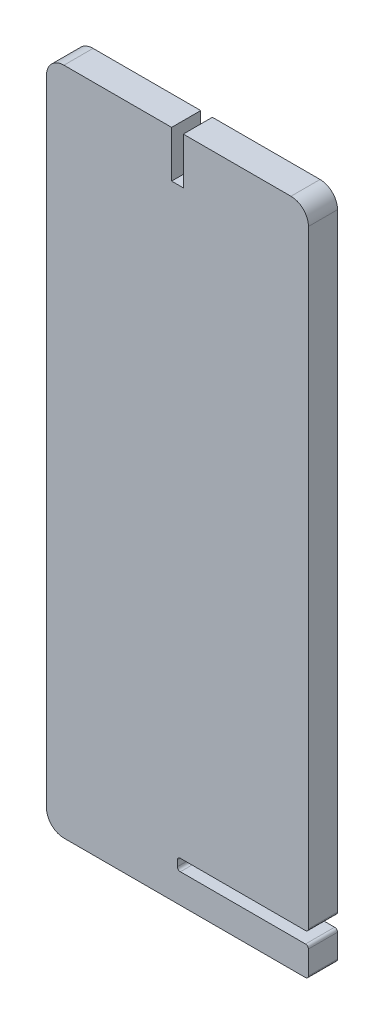
ISO-10303-21;
HEADER;
FILE_DESCRIPTION(('STEP AP214'),'2;1');
FILE_NAME('part.step','',(''),(''),'','','');
FILE_SCHEMA(('AUTOMOTIVE_DESIGN { 1 0 10303 214 1 1 1 1 }'));
ENDSEC;
DATA;
#1=APPLICATION_CONTEXT('core data for automotive mechanical design processes');
#2=APPLICATION_PROTOCOL_DEFINITION('international standard','automotive_design',2000,#1);
#3=PRODUCT_CONTEXT('',#1,'mechanical');
#4=PRODUCT('Part','Part','',(#3));
#5=PRODUCT_RELATED_PRODUCT_CATEGORY('part','',(#4));
#6=PRODUCT_DEFINITION_FORMATION('','',#4);
#7=PRODUCT_DEFINITION_CONTEXT('part definition',#1,'design');
#8=PRODUCT_DEFINITION('design','',#6,#7);
#9=PRODUCT_DEFINITION_SHAPE('','',#8);
#10=(LENGTH_UNIT() NAMED_UNIT(*) SI_UNIT(.MILLI.,.METRE.));
#11=(NAMED_UNIT(*) PLANE_ANGLE_UNIT() SI_UNIT($,.RADIAN.));
#12=(NAMED_UNIT(*) SI_UNIT($,.STERADIAN.) SOLID_ANGLE_UNIT());
#13=UNCERTAINTY_MEASURE_WITH_UNIT(LENGTH_MEASURE(1.E-05),#10,'distance_accuracy_value','');
#14=(GEOMETRIC_REPRESENTATION_CONTEXT(3) GLOBAL_UNCERTAINTY_ASSIGNED_CONTEXT((#13)) GLOBAL_UNIT_ASSIGNED_CONTEXT((#10,
#11,#12)) REPRESENTATION_CONTEXT('',''));
#15=CARTESIAN_POINT('',(0.,0.,0.));
#16=DIRECTION('',(0.,0.,1.));
#17=DIRECTION('',(1.,0.,0.));
#18=AXIS2_PLACEMENT_3D('',#15,#16,#17);
#19=CARTESIAN_POINT('',(-22.5,45.,5.));
#20=DIRECTION('',(0.,1.,0.));
#21=DIRECTION('',(0.,0.,1.));
#22=AXIS2_PLACEMENT_3D('',#19,#20,#21);
#23=PLANE('',#22);
#24=DIRECTION('',(0.,0.,1.));
#25=VECTOR('',#24,1.);
#26=CARTESIAN_POINT('',(1.,45.,-8.24621125123532));
#27=LINE('',#26,#25);
#28=CARTESIAN_POINT('',(1.,45.,0.));
#29=VERTEX_POINT('',#28);
#30=CARTESIAN_POINT('',(1.,45.,5.));
#31=VERTEX_POINT('',#30);
#32=EDGE_CURVE('E188',#29,#31,#27,.T.);
#33=ORIENTED_EDGE('',*,*,#32,.T.);
#34=DIRECTION('',(1.,0.,0.));
#35=VECTOR('',#34,1.);
#36=CARTESIAN_POINT('',(-22.5,45.,5.));
#37=LINE('',#36,#35);
#38=CARTESIAN_POINT('',(19.5,45.,5.));
#39=VERTEX_POINT('',#38);
#40=EDGE_CURVE('E257',#31,#39,#37,.T.);
#41=ORIENTED_EDGE('',*,*,#40,.T.);
#42=DIRECTION('',(0.,0.,-1.));
#43=VECTOR('',#42,1.);
#44=CARTESIAN_POINT('',(19.5,45.,5.));
#45=LINE('',#44,#43);
#46=CARTESIAN_POINT('',(19.5,45.,0.));
#47=VERTEX_POINT('',#46);
#48=EDGE_CURVE('E316',#39,#47,#45,.T.);
#49=ORIENTED_EDGE('',*,*,#48,.T.);
#50=DIRECTION('',(1.,0.,0.));
#51=VECTOR('',#50,1.);
#52=CARTESIAN_POINT('',(-22.5,45.,0.));
#53=LINE('',#52,#51);
#54=EDGE_CURVE('E248',#29,#47,#53,.T.);
#55=ORIENTED_EDGE('',*,*,#54,.F.);
#56=EDGE_LOOP('',(#33,#41,#49,#55));
#57=FACE_BOUND('',#56,.T.);
#58=ADVANCED_FACE('F43',(#57),#23,.T.);
#59=CARTESIAN_POINT('',(22.5,45.,5.));
#60=DIRECTION('',(1.,0.,0.));
#61=DIRECTION('',(0.,1.,0.));
#62=AXIS2_PLACEMENT_3D('',#59,#60,#61);
#63=PLANE('',#62);
#64=DIRECTION('',(0.,-1.,0.));
#65=VECTOR('',#64,1.);
#66=CARTESIAN_POINT('',(22.5,45.,5.));
#67=LINE('',#66,#65);
#68=CARTESIAN_POINT('',(22.5,42.,5.));
#69=VERTEX_POINT('',#68);
#70=CARTESIAN_POINT('',(22.5,-62.5,5.));
#71=VERTEX_POINT('',#70);
#72=EDGE_CURVE('E258',#69,#71,#67,.T.);
#73=ORIENTED_EDGE('',*,*,#72,.T.);
#74=DIRECTION('',(0.,0.,1.));
#75=VECTOR('',#74,1.);
#76=CARTESIAN_POINT('',(22.5,-62.5,0.));
#77=LINE('',#76,#75);
#78=CARTESIAN_POINT('',(22.5,-62.5,0.));
#79=VERTEX_POINT('',#78);
#80=EDGE_CURVE('E371',#71,#79,#77,.F.);
#81=ORIENTED_EDGE('',*,*,#80,.T.);
#82=DIRECTION('',(0.,-1.,0.));
#83=VECTOR('',#82,1.);
#84=CARTESIAN_POINT('',(22.5,45.,0.));
#85=LINE('',#84,#83);
#86=CARTESIAN_POINT('',(22.5,42.,0.));
#87=VERTEX_POINT('',#86);
#88=EDGE_CURVE('E273',#87,#79,#85,.T.);
#89=ORIENTED_EDGE('',*,*,#88,.F.);
#90=DIRECTION('',(0.,0.,-1.));
#91=VECTOR('',#90,1.);
#92=CARTESIAN_POINT('',(22.5,42.,5.));
#93=LINE('',#92,#91);
#94=EDGE_CURVE('E320',#87,#69,#93,.F.);
#95=ORIENTED_EDGE('',*,*,#94,.T.);
#96=EDGE_LOOP('',(#73,#81,#89,#95));
#97=FACE_BOUND('',#96,.T.);
#98=ADVANCED_FACE('F420',(#97),#63,.T.);
#99=DIRECTION('',(0.,0.,1.));
#100=VECTOR('',#99,1.);
#101=CARTESIAN_POINT('',(-1.,45.,-8.24621125123532));
#102=LINE('',#101,#100);
#103=CARTESIAN_POINT('',(-1.,45.,0.));
#104=VERTEX_POINT('',#103);
#105=CARTESIAN_POINT('',(-1.,45.,5.));
#106=VERTEX_POINT('',#105);
#107=EDGE_CURVE('E219',#104,#106,#102,.T.);
#108=ORIENTED_EDGE('',*,*,#107,.F.);
#109=CARTESIAN_POINT('',(-19.5,45.,0.));
#110=VERTEX_POINT('',#109);
#111=EDGE_CURVE('E269',#110,#104,#53,.T.);
#112=ORIENTED_EDGE('',*,*,#111,.F.);
#113=DIRECTION('',(0.,0.,-1.));
#114=VECTOR('',#113,1.);
#115=CARTESIAN_POINT('',(-19.5,45.,5.));
#116=LINE('',#115,#114);
#117=CARTESIAN_POINT('',(-19.5,45.,5.));
#118=VERTEX_POINT('',#117);
#119=EDGE_CURVE('E313',#110,#118,#116,.F.);
#120=ORIENTED_EDGE('',*,*,#119,.T.);
#121=EDGE_CURVE('E252',#118,#106,#37,.T.);
#122=ORIENTED_EDGE('',*,*,#121,.T.);
#123=EDGE_LOOP('',(#108,#112,#120,#122));
#124=FACE_BOUND('',#123,.T.);
#125=ADVANCED_FACE('F445',(#124),#23,.T.);
#126=CARTESIAN_POINT('',(-22.5,45.,5.));
#127=DIRECTION('',(1.,0.,0.));
#128=DIRECTION('',(0.,1.,0.));
#129=AXIS2_PLACEMENT_3D('',#126,#127,#128);
#130=PLANE('',#129);
#131=DIRECTION('',(0.,-1.,0.));
#132=VECTOR('',#131,1.);
#133=CARTESIAN_POINT('',(-22.5,45.,0.));
#134=LINE('',#133,#132);
#135=CARTESIAN_POINT('',(-22.5,42.,0.));
#136=VERTEX_POINT('',#135);
#137=CARTESIAN_POINT('',(-22.5,-67.,0.));
#138=VERTEX_POINT('',#137);
#139=EDGE_CURVE('E280',#136,#138,#134,.T.);
#140=ORIENTED_EDGE('',*,*,#139,.T.);
#141=DIRECTION('',(0.,0.,-1.));
#142=VECTOR('',#141,1.);
#143=CARTESIAN_POINT('',(-22.5,-67.,5.));
#144=LINE('',#143,#142);
#145=CARTESIAN_POINT('',(-22.5,-67.,5.));
#146=VERTEX_POINT('',#145);
#147=EDGE_CURVE('E300',#138,#146,#144,.F.);
#148=ORIENTED_EDGE('',*,*,#147,.T.);
#149=DIRECTION('',(0.,-1.,0.));
#150=VECTOR('',#149,1.);
#151=CARTESIAN_POINT('',(-22.5,45.,5.));
#152=LINE('',#151,#150);
#153=CARTESIAN_POINT('',(-22.5,42.,5.));
#154=VERTEX_POINT('',#153);
#155=EDGE_CURVE('E264',#154,#146,#152,.T.);
#156=ORIENTED_EDGE('',*,*,#155,.F.);
#157=DIRECTION('',(0.,0.,-1.));
#158=VECTOR('',#157,1.);
#159=CARTESIAN_POINT('',(-22.5,42.,0.));
#160=LINE('',#159,#158);
#161=EDGE_CURVE('E296',#154,#136,#160,.T.);
#162=ORIENTED_EDGE('',*,*,#161,.T.);
#163=EDGE_LOOP('',(#140,#148,#156,#162));
#164=FACE_BOUND('',#163,.T.);
#165=ADVANCED_FACE('F452',(#164),#130,.F.);
#166=CARTESIAN_POINT('',(-22.5,-70.,5.));
#167=DIRECTION('',(0.,1.,0.));
#168=DIRECTION('',(0.,0.,1.));
#169=AXIS2_PLACEMENT_3D('',#166,#167,#168);
#170=PLANE('',#169);
#171=DIRECTION('',(1.,0.,0.));
#172=VECTOR('',#171,1.);
#173=CARTESIAN_POINT('',(-22.5,-70.,0.));
#174=LINE('',#173,#172);
#175=CARTESIAN_POINT('',(-19.5,-70.,0.));
#176=VERTEX_POINT('',#175);
#177=CARTESIAN_POINT('',(22.,-70.,0.));
#178=VERTEX_POINT('',#177);
#179=EDGE_CURVE('E277',#176,#178,#174,.T.);
#180=ORIENTED_EDGE('',*,*,#179,.T.);
#181=DIRECTION('',(0.,0.,-1.));
#182=VECTOR('',#181,1.);
#183=CARTESIAN_POINT('',(22.,-70.,5.));
#184=LINE('',#183,#182);
#185=CARTESIAN_POINT('',(22.,-70.,5.));
#186=VERTEX_POINT('',#185);
#187=EDGE_CURVE('E67',#178,#186,#184,.F.);
#188=ORIENTED_EDGE('',*,*,#187,.T.);
#189=DIRECTION('',(1.,0.,0.));
#190=VECTOR('',#189,1.);
#191=CARTESIAN_POINT('',(-22.5,-70.,5.));
#192=LINE('',#191,#190);
#193=CARTESIAN_POINT('',(-19.5,-70.,5.));
#194=VERTEX_POINT('',#193);
#195=EDGE_CURVE('E261',#194,#186,#192,.T.);
#196=ORIENTED_EDGE('',*,*,#195,.F.);
#197=DIRECTION('',(0.,0.,-1.));
#198=VECTOR('',#197,1.);
#199=CARTESIAN_POINT('',(-19.5,-70.,5.));
#200=LINE('',#199,#198);
#201=EDGE_CURVE('E268',#194,#176,#200,.T.);
#202=ORIENTED_EDGE('',*,*,#201,.T.);
#203=EDGE_LOOP('',(#180,#188,#196,#202));
#204=FACE_BOUND('',#203,.T.);
#205=ADVANCED_FACE('F457',(#204),#170,.F.);
#206=CARTESIAN_POINT('',(22.5,-65.5,5.));
#207=VERTEX_POINT('',#206);
#208=CARTESIAN_POINT('',(22.5,-69.5,5.));
#209=VERTEX_POINT('',#208);
#210=EDGE_CURVE('E256',#207,#209,#67,.T.);
#211=ORIENTED_EDGE('',*,*,#210,.T.);
#212=DIRECTION('',(0.,0.,-1.));
#213=VECTOR('',#212,1.);
#214=CARTESIAN_POINT('',(22.5,-69.5,0.));
#215=LINE('',#214,#213);
#216=CARTESIAN_POINT('',(22.5,-69.5,0.));
#217=VERTEX_POINT('',#216);
#218=EDGE_CURVE('E348',#209,#217,#215,.T.);
#219=ORIENTED_EDGE('',*,*,#218,.T.);
#220=CARTESIAN_POINT('',(22.5,-65.5,0.));
#221=VERTEX_POINT('',#220);
#222=EDGE_CURVE('E272',#221,#217,#85,.T.);
#223=ORIENTED_EDGE('',*,*,#222,.F.);
#224=DIRECTION('',(0.,0.,1.));
#225=VECTOR('',#224,1.);
#226=CARTESIAN_POINT('',(22.5,-65.5,5.));
#227=LINE('',#226,#225);
#228=EDGE_CURVE('E344',#221,#207,#227,.T.);
#229=ORIENTED_EDGE('',*,*,#228,.T.);
#230=EDGE_LOOP('',(#211,#219,#223,#229));
#231=FACE_BOUND('',#230,.T.);
#232=ADVANCED_FACE('F403',(#231),#63,.T.);
#233=CARTESIAN_POINT('',(0.,0.,5.));
#234=DIRECTION('',(0.,0.,-1.));
#235=DIRECTION('',(-1.,0.,0.));
#236=AXIS2_PLACEMENT_3D('',#233,#234,#235);
#237=PLANE('',#236);
#238=ORIENTED_EDGE('',*,*,#195,.T.);
#239=CARTESIAN_POINT('',(22.,-69.5,5.));
#240=DIRECTION('',(0.,0.,-1.));
#241=DIRECTION('',(-1.,0.,0.));
#242=AXIS2_PLACEMENT_3D('',#239,#240,#241);
#243=CIRCLE('',#242,0.5);
#244=EDGE_CURVE('E368',#186,#209,#243,.F.);
#245=ORIENTED_EDGE('',*,*,#244,.T.);
#246=ORIENTED_EDGE('',*,*,#210,.F.);
#247=CARTESIAN_POINT('',(22.,-65.5,5.));
#248=DIRECTION('',(0.,0.,-1.));
#249=DIRECTION('',(-1.,0.,0.));
#250=AXIS2_PLACEMENT_3D('',#247,#248,#249);
#251=CIRCLE('',#250,0.5);
#252=CARTESIAN_POINT('',(22.,-65.,5.));
#253=VERTEX_POINT('',#252);
#254=EDGE_CURVE('E365',#207,#253,#251,.F.);
#255=ORIENTED_EDGE('',*,*,#254,.T.);
#256=DIRECTION('',(1.,0.,0.));
#257=VECTOR('',#256,1.);
#258=CARTESIAN_POINT('',(22.5,-65.,5.));
#259=LINE('',#258,#257);
#260=CARTESIAN_POINT('',(0.500000000000004,-65.,5.));
#261=VERTEX_POINT('',#260);
#262=EDGE_CURVE('E228',#261,#253,#259,.T.);
#263=ORIENTED_EDGE('',*,*,#262,.F.);
#264=CARTESIAN_POINT('',(0.499999999999997,-64.5,5.));
#265=DIRECTION('',(0.,0.,-1.));
#266=DIRECTION('',(-1.,0.,0.));
#267=AXIS2_PLACEMENT_3D('',#264,#265,#266);
#268=CIRCLE('',#267,0.5);
#269=CARTESIAN_POINT('',(0.,-64.5,5.));
#270=VERTEX_POINT('',#269);
#271=EDGE_CURVE('E52',#261,#270,#268,.T.);
#272=ORIENTED_EDGE('',*,*,#271,.T.);
#273=DIRECTION('',(0.,-1.,0.));
#274=VECTOR('',#273,1.);
#275=CARTESIAN_POINT('',(0.,-63.,5.));
#276=LINE('',#275,#274);
#277=CARTESIAN_POINT('',(0.,-63.5,5.));
#278=VERTEX_POINT('',#277);
#279=EDGE_CURVE('E233',#278,#270,#276,.T.);
#280=ORIENTED_EDGE('',*,*,#279,.F.);
#281=CARTESIAN_POINT('',(0.499999999999996,-63.5,5.));
#282=DIRECTION('',(0.,0.,-1.));
#283=DIRECTION('',(-1.,0.,0.));
#284=AXIS2_PLACEMENT_3D('',#281,#282,#283);
#285=CIRCLE('',#284,0.5);
#286=CARTESIAN_POINT('',(0.500000000000004,-63.,5.));
#287=VERTEX_POINT('',#286);
#288=EDGE_CURVE('E374',#278,#287,#285,.T.);
#289=ORIENTED_EDGE('',*,*,#288,.T.);
#290=DIRECTION('',(-1.,0.,0.));
#291=VECTOR('',#290,1.);
#292=CARTESIAN_POINT('',(22.5,-63.,5.));
#293=LINE('',#292,#291);
#294=CARTESIAN_POINT('',(22.,-63.,5.));
#295=VERTEX_POINT('',#294);
#296=EDGE_CURVE('E227',#295,#287,#293,.T.);
#297=ORIENTED_EDGE('',*,*,#296,.F.);
#298=CARTESIAN_POINT('',(22.,-62.5,5.));
#299=DIRECTION('',(0.,0.,-1.));
#300=DIRECTION('',(-1.,0.,0.));
#301=AXIS2_PLACEMENT_3D('',#298,#299,#300);
#302=CIRCLE('',#301,0.5);
#303=EDGE_CURVE('E59',#295,#71,#302,.F.);
#304=ORIENTED_EDGE('',*,*,#303,.T.);
#305=ORIENTED_EDGE('',*,*,#72,.F.);
#306=CARTESIAN_POINT('',(19.5,42.,5.));
#307=DIRECTION('',(0.,0.,-1.));
#308=DIRECTION('',(-1.,0.,0.));
#309=AXIS2_PLACEMENT_3D('',#306,#307,#308);
#310=CIRCLE('',#309,3.);
#311=EDGE_CURVE('E306',#69,#39,#310,.F.);
#312=ORIENTED_EDGE('',*,*,#311,.T.);
#313=ORIENTED_EDGE('',*,*,#40,.F.);
#314=DIRECTION('',(0.,1.,0.));
#315=VECTOR('',#314,1.);
#316=CARTESIAN_POINT('',(1.,45.,5.));
#317=LINE('',#316,#315);
#318=CARTESIAN_POINT('',(1.,37.,5.));
#319=VERTEX_POINT('',#318);
#320=EDGE_CURVE('E209',#319,#31,#317,.T.);
#321=ORIENTED_EDGE('',*,*,#320,.F.);
#322=DIRECTION('',(1.,0.,0.));
#323=VECTOR('',#322,1.);
#324=CARTESIAN_POINT('',(-0.999999999999999,37.,5.));
#325=LINE('',#324,#323);
#326=CARTESIAN_POINT('',(-0.999999999999999,37.,5.));
#327=VERTEX_POINT('',#326);
#328=EDGE_CURVE('E200',#327,#319,#325,.T.);
#329=ORIENTED_EDGE('',*,*,#328,.F.);
#330=DIRECTION('',(0.,-1.,0.));
#331=VECTOR('',#330,1.);
#332=CARTESIAN_POINT('',(-1.,45.,5.));
#333=LINE('',#332,#331);
#334=EDGE_CURVE('E215',#106,#327,#333,.T.);
#335=ORIENTED_EDGE('',*,*,#334,.F.);
#336=ORIENTED_EDGE('',*,*,#121,.F.);
#337=CARTESIAN_POINT('',(-19.5,42.,5.));
#338=DIRECTION('',(0.,0.,-1.));
#339=DIRECTION('',(-1.,0.,0.));
#340=AXIS2_PLACEMENT_3D('',#337,#338,#339);
#341=CIRCLE('',#340,3.);
#342=EDGE_CURVE('E303',#118,#154,#341,.F.);
#343=ORIENTED_EDGE('',*,*,#342,.T.);
#344=ORIENTED_EDGE('',*,*,#155,.T.);
#345=CARTESIAN_POINT('',(-19.5,-67.,5.));
#346=DIRECTION('',(0.,0.,-1.));
#347=DIRECTION('',(-1.,0.,0.));
#348=AXIS2_PLACEMENT_3D('',#345,#346,#347);
#349=CIRCLE('',#348,3.);
#350=EDGE_CURVE('E310',#146,#194,#349,.F.);
#351=ORIENTED_EDGE('',*,*,#350,.T.);
#352=EDGE_LOOP('',(#238,#245,#246,#255,#263,#272,#280,#289,#297,#304,#305,#312,#313,#321,#329,
#335,#336,#343,#344,#351));
#353=FACE_BOUND('',#352,.T.);
#354=ADVANCED_FACE('F382',(#353),#237,.F.);
#355=CARTESIAN_POINT('',(0.,0.,0.));
#356=DIRECTION('',(0.,0.,-1.));
#357=DIRECTION('',(-1.,0.,0.));
#358=AXIS2_PLACEMENT_3D('',#355,#356,#357);
#359=PLANE('',#358);
#360=ORIENTED_EDGE('',*,*,#222,.T.);
#361=CARTESIAN_POINT('',(22.,-69.5,0.));
#362=DIRECTION('',(0.,0.,-1.));
#363=DIRECTION('',(-1.,0.,0.));
#364=AXIS2_PLACEMENT_3D('',#361,#362,#363);
#365=CIRCLE('',#364,0.5);
#366=EDGE_CURVE('E358',#217,#178,#365,.T.);
#367=ORIENTED_EDGE('',*,*,#366,.T.);
#368=ORIENTED_EDGE('',*,*,#179,.F.);
#369=CARTESIAN_POINT('',(-19.5,-67.,0.));
#370=DIRECTION('',(0.,0.,-1.));
#371=DIRECTION('',(-1.,0.,0.));
#372=AXIS2_PLACEMENT_3D('',#369,#370,#371);
#373=CIRCLE('',#372,3.);
#374=EDGE_CURVE('E293',#176,#138,#373,.T.);
#375=ORIENTED_EDGE('',*,*,#374,.T.);
#376=ORIENTED_EDGE('',*,*,#139,.F.);
#377=CARTESIAN_POINT('',(-19.5,42.,0.));
#378=DIRECTION('',(0.,0.,-1.));
#379=DIRECTION('',(-1.,0.,0.));
#380=AXIS2_PLACEMENT_3D('',#377,#378,#379);
#381=CIRCLE('',#380,3.);
#382=EDGE_CURVE('E287',#136,#110,#381,.T.);
#383=ORIENTED_EDGE('',*,*,#382,.T.);
#384=ORIENTED_EDGE('',*,*,#111,.T.);
#385=DIRECTION('',(0.,-1.,0.));
#386=VECTOR('',#385,1.);
#387=CARTESIAN_POINT('',(-1.,45.,0.));
#388=LINE('',#387,#386);
#389=CARTESIAN_POINT('',(-0.999999999999999,37.,0.));
#390=VERTEX_POINT('',#389);
#391=EDGE_CURVE('E207',#104,#390,#388,.T.);
#392=ORIENTED_EDGE('',*,*,#391,.T.);
#393=DIRECTION('',(1.,0.,0.));
#394=VECTOR('',#393,1.);
#395=CARTESIAN_POINT('',(-0.999999999999999,37.,0.));
#396=LINE('',#395,#394);
#397=CARTESIAN_POINT('',(1.,37.,0.));
#398=VERTEX_POINT('',#397);
#399=EDGE_CURVE('E197',#390,#398,#396,.T.);
#400=ORIENTED_EDGE('',*,*,#399,.T.);
#401=DIRECTION('',(0.,1.,0.));
#402=VECTOR('',#401,1.);
#403=CARTESIAN_POINT('',(1.,45.,0.));
#404=LINE('',#403,#402);
#405=EDGE_CURVE('E182',#398,#29,#404,.T.);
#406=ORIENTED_EDGE('',*,*,#405,.T.);
#407=ORIENTED_EDGE('',*,*,#54,.T.);
#408=CARTESIAN_POINT('',(19.5,42.,0.));
#409=DIRECTION('',(0.,0.,-1.));
#410=DIRECTION('',(-1.,0.,0.));
#411=AXIS2_PLACEMENT_3D('',#408,#409,#410);
#412=CIRCLE('',#411,3.);
#413=EDGE_CURVE('E290',#47,#87,#412,.T.);
#414=ORIENTED_EDGE('',*,*,#413,.T.);
#415=ORIENTED_EDGE('',*,*,#88,.T.);
#416=CARTESIAN_POINT('',(22.,-62.5,0.));
#417=DIRECTION('',(0.,0.,-1.));
#418=DIRECTION('',(-1.,0.,0.));
#419=AXIS2_PLACEMENT_3D('',#416,#417,#418);
#420=CIRCLE('',#419,0.5);
#421=CARTESIAN_POINT('',(22.,-63.,0.));
#422=VERTEX_POINT('',#421);
#423=EDGE_CURVE('E352',#79,#422,#420,.T.);
#424=ORIENTED_EDGE('',*,*,#423,.T.);
#425=DIRECTION('',(-1.,0.,0.));
#426=VECTOR('',#425,1.);
#427=CARTESIAN_POINT('',(22.5,-63.,0.));
#428=LINE('',#427,#426);
#429=CARTESIAN_POINT('',(0.499999999999997,-63.,0.));
#430=VERTEX_POINT('',#429);
#431=EDGE_CURVE('E232',#422,#430,#428,.T.);
#432=ORIENTED_EDGE('',*,*,#431,.T.);
#433=CARTESIAN_POINT('',(0.499999999999996,-63.5,0.));
#434=DIRECTION('',(0.,0.,-1.));
#435=DIRECTION('',(-1.,0.,0.));
#436=AXIS2_PLACEMENT_3D('',#433,#434,#435);
#437=CIRCLE('',#436,0.5);
#438=CARTESIAN_POINT('',(0.,-63.5,0.));
#439=VERTEX_POINT('',#438);
#440=EDGE_CURVE('E377',#430,#439,#437,.F.);
#441=ORIENTED_EDGE('',*,*,#440,.T.);
#442=DIRECTION('',(0.,-1.,0.));
#443=VECTOR('',#442,1.);
#444=CARTESIAN_POINT('',(0.,-63.,0.));
#445=LINE('',#444,#443);
#446=CARTESIAN_POINT('',(0.,-64.5,0.));
#447=VERTEX_POINT('',#446);
#448=EDGE_CURVE('E243',#439,#447,#445,.T.);
#449=ORIENTED_EDGE('',*,*,#448,.T.);
#450=CARTESIAN_POINT('',(0.499999999999997,-64.5,0.));
#451=DIRECTION('',(0.,0.,-1.));
#452=DIRECTION('',(-1.,0.,0.));
#453=AXIS2_PLACEMENT_3D('',#450,#451,#452);
#454=CIRCLE('',#453,0.5);
#455=CARTESIAN_POINT('',(0.499999999999997,-65.,0.));
#456=VERTEX_POINT('',#455);
#457=EDGE_CURVE('E11',#447,#456,#454,.F.);
#458=ORIENTED_EDGE('',*,*,#457,.T.);
#459=DIRECTION('',(1.,0.,0.));
#460=VECTOR('',#459,1.);
#461=CARTESIAN_POINT('',(22.5,-65.,0.));
#462=LINE('',#461,#460);
#463=CARTESIAN_POINT('',(22.,-65.,0.));
#464=VERTEX_POINT('',#463);
#465=EDGE_CURVE('E244',#456,#464,#462,.T.);
#466=ORIENTED_EDGE('',*,*,#465,.T.);
#467=CARTESIAN_POINT('',(22.,-65.5,0.));
#468=DIRECTION('',(0.,0.,-1.));
#469=DIRECTION('',(-1.,0.,0.));
#470=AXIS2_PLACEMENT_3D('',#467,#468,#469);
#471=CIRCLE('',#470,0.5);
#472=EDGE_CURVE('E355',#464,#221,#471,.T.);
#473=ORIENTED_EDGE('',*,*,#472,.T.);
#474=EDGE_LOOP('',(#360,#367,#368,#375,#376,#383,#384,#392,#400,#406,#407,#414,#415,#424,#432,
#441,#449,#458,#466,#473));
#475=FACE_BOUND('',#474,.T.);
#476=ADVANCED_FACE('F205',(#475),#359,.T.);
#477=CARTESIAN_POINT('',(22.5,-63.,-22.588713996153));
#478=DIRECTION('',(0.,1.,0.));
#479=DIRECTION('',(0.,0.,1.));
#480=AXIS2_PLACEMENT_3D('',#477,#478,#479);
#481=PLANE('',#480);
#482=ORIENTED_EDGE('',*,*,#296,.T.);
#483=DIRECTION('',(0.,0.,1.));
#484=VECTOR('',#483,1.);
#485=CARTESIAN_POINT('',(0.499999999999996,-63.,0.));
#486=LINE('',#485,#484);
#487=EDGE_CURVE('E334',#287,#430,#486,.F.);
#488=ORIENTED_EDGE('',*,*,#487,.T.);
#489=ORIENTED_EDGE('',*,*,#431,.F.);
#490=DIRECTION('',(0.,0.,1.));
#491=VECTOR('',#490,1.);
#492=CARTESIAN_POINT('',(22.,-63.,5.));
#493=LINE('',#492,#491);
#494=EDGE_CURVE('E330',#422,#295,#493,.T.);
#495=ORIENTED_EDGE('',*,*,#494,.T.);
#496=EDGE_LOOP('',(#482,#488,#489,#495));
#497=FACE_BOUND('',#496,.T.);
#498=ADVANCED_FACE('F427',(#497),#481,.F.);
#499=CARTESIAN_POINT('',(0.,-63.,-22.588713996153));
#500=DIRECTION('',(-1.,0.,0.));
#501=DIRECTION('',(0.,-1.,0.));
#502=AXIS2_PLACEMENT_3D('',#499,#500,#501);
#503=PLANE('',#502);
#504=ORIENTED_EDGE('',*,*,#448,.F.);
#505=DIRECTION('',(0.,0.,1.));
#506=VECTOR('',#505,1.);
#507=CARTESIAN_POINT('',(0.,-63.5,5.));
#508=LINE('',#507,#506);
#509=EDGE_CURVE('E326',#439,#278,#508,.T.);
#510=ORIENTED_EDGE('',*,*,#509,.T.);
#511=ORIENTED_EDGE('',*,*,#279,.T.);
#512=DIRECTION('',(0.,0.,1.));
#513=VECTOR('',#512,1.);
#514=CARTESIAN_POINT('',(0.,-64.5,0.));
#515=LINE('',#514,#513);
#516=EDGE_CURVE('E323',#270,#447,#515,.F.);
#517=ORIENTED_EDGE('',*,*,#516,.T.);
#518=EDGE_LOOP('',(#504,#510,#511,#517));
#519=FACE_BOUND('',#518,.T.);
#520=ADVANCED_FACE('F388',(#519),#503,.F.);
#521=CARTESIAN_POINT('',(22.5,-65.,-22.588713996153));
#522=DIRECTION('',(0.,-1.,0.));
#523=DIRECTION('',(0.,0.,-1.));
#524=AXIS2_PLACEMENT_3D('',#521,#522,#523);
#525=PLANE('',#524);
#526=ORIENTED_EDGE('',*,*,#465,.F.);
#527=DIRECTION('',(0.,0.,1.));
#528=VECTOR('',#527,1.);
#529=CARTESIAN_POINT('',(0.499999999999997,-65.,5.));
#530=LINE('',#529,#528);
#531=EDGE_CURVE('E340',#456,#261,#530,.T.);
#532=ORIENTED_EDGE('',*,*,#531,.T.);
#533=ORIENTED_EDGE('',*,*,#262,.T.);
#534=DIRECTION('',(0.,0.,1.));
#535=VECTOR('',#534,1.);
#536=CARTESIAN_POINT('',(22.,-65.,0.));
#537=LINE('',#536,#535);
#538=EDGE_CURVE('E337',#253,#464,#537,.F.);
#539=ORIENTED_EDGE('',*,*,#538,.T.);
#540=EDGE_LOOP('',(#526,#532,#533,#539));
#541=FACE_BOUND('',#540,.T.);
#542=ADVANCED_FACE('F395',(#541),#525,.F.);
#543=CARTESIAN_POINT('',(-19.5,-67.,5.));
#544=DIRECTION('',(0.,0.,-1.));
#545=DIRECTION('',(-1.,0.,0.));
#546=AXIS2_PLACEMENT_3D('',#543,#544,#545);
#547=CYLINDRICAL_SURFACE('',#546,3.);
#548=ORIENTED_EDGE('',*,*,#350,.F.);
#549=ORIENTED_EDGE('',*,*,#147,.F.);
#550=ORIENTED_EDGE('',*,*,#374,.F.);
#551=ORIENTED_EDGE('',*,*,#201,.F.);
#552=EDGE_LOOP('',(#548,#549,#550,#551));
#553=FACE_BOUND('',#552,.T.);
#554=ADVANCED_FACE('F476',(#553),#547,.T.);
#555=CARTESIAN_POINT('',(19.5,42.,5.));
#556=DIRECTION('',(0.,0.,-1.));
#557=DIRECTION('',(-1.,0.,0.));
#558=AXIS2_PLACEMENT_3D('',#555,#556,#557);
#559=CYLINDRICAL_SURFACE('',#558,3.);
#560=ORIENTED_EDGE('',*,*,#311,.F.);
#561=ORIENTED_EDGE('',*,*,#94,.F.);
#562=ORIENTED_EDGE('',*,*,#413,.F.);
#563=ORIENTED_EDGE('',*,*,#48,.F.);
#564=EDGE_LOOP('',(#560,#561,#562,#563));
#565=FACE_BOUND('',#564,.T.);
#566=ADVANCED_FACE('F415',(#565),#559,.T.);
#567=CARTESIAN_POINT('',(-19.5,42.,5.));
#568=DIRECTION('',(0.,0.,1.));
#569=DIRECTION('',(1.,0.,0.));
#570=AXIS2_PLACEMENT_3D('',#567,#568,#569);
#571=CYLINDRICAL_SURFACE('',#570,3.);
#572=ORIENTED_EDGE('',*,*,#342,.F.);
#573=ORIENTED_EDGE('',*,*,#119,.F.);
#574=ORIENTED_EDGE('',*,*,#382,.F.);
#575=ORIENTED_EDGE('',*,*,#161,.F.);
#576=EDGE_LOOP('',(#572,#573,#574,#575));
#577=FACE_BOUND('',#576,.T.);
#578=ADVANCED_FACE('F470',(#577),#571,.T.);
#579=CARTESIAN_POINT('',(-0.999999999999999,37.,-8.24621125123532));
#580=DIRECTION('',(0.,-1.,0.));
#581=DIRECTION('',(0.,0.,-1.));
#582=AXIS2_PLACEMENT_3D('',#579,#580,#581);
#583=PLANE('',#582);
#584=DIRECTION('',(0.,0.,1.));
#585=VECTOR('',#584,1.);
#586=CARTESIAN_POINT('',(-0.999999999999999,37.,-8.24621125123532));
#587=LINE('',#586,#585);
#588=EDGE_CURVE('E218',#390,#327,#587,.T.);
#589=ORIENTED_EDGE('',*,*,#588,.T.);
#590=ORIENTED_EDGE('',*,*,#328,.T.);
#591=DIRECTION('',(0.,0.,1.));
#592=VECTOR('',#591,1.);
#593=CARTESIAN_POINT('',(1.,37.,-8.24621125123532));
#594=LINE('',#593,#592);
#595=EDGE_CURVE('E185',#398,#319,#594,.T.);
#596=ORIENTED_EDGE('',*,*,#595,.F.);
#597=ORIENTED_EDGE('',*,*,#399,.F.);
#598=EDGE_LOOP('',(#589,#590,#596,#597));
#599=FACE_BOUND('',#598,.T.);
#600=ADVANCED_FACE('F196',(#599),#583,.F.);
#601=CARTESIAN_POINT('',(1.,45.,-8.24621125123532));
#602=DIRECTION('',(1.,0.,0.));
#603=DIRECTION('',(0.,1.,0.));
#604=AXIS2_PLACEMENT_3D('',#601,#602,#603);
#605=PLANE('',#604);
#606=ORIENTED_EDGE('',*,*,#595,.T.);
#607=ORIENTED_EDGE('',*,*,#320,.T.);
#608=ORIENTED_EDGE('',*,*,#32,.F.);
#609=ORIENTED_EDGE('',*,*,#405,.F.);
#610=EDGE_LOOP('',(#606,#607,#608,#609));
#611=FACE_BOUND('',#610,.T.);
#612=ADVANCED_FACE('F184',(#611),#605,.F.);
#613=CARTESIAN_POINT('',(-1.,45.,-8.24621125123532));
#614=DIRECTION('',(-1.,0.,0.));
#615=DIRECTION('',(0.,-1.,0.));
#616=AXIS2_PLACEMENT_3D('',#613,#614,#615);
#617=PLANE('',#616);
#618=ORIENTED_EDGE('',*,*,#107,.T.);
#619=ORIENTED_EDGE('',*,*,#334,.T.);
#620=ORIENTED_EDGE('',*,*,#588,.F.);
#621=ORIENTED_EDGE('',*,*,#391,.F.);
#622=EDGE_LOOP('',(#618,#619,#620,#621));
#623=FACE_BOUND('',#622,.T.);
#624=ADVANCED_FACE('F432',(#623),#617,.F.);
#625=CARTESIAN_POINT('',(0.499999999999996,-63.5,-22.588713996153));
#626=DIRECTION('',(0.,0.,-1.));
#627=DIRECTION('',(-1.,0.,0.));
#628=AXIS2_PLACEMENT_3D('',#625,#626,#627);
#629=CYLINDRICAL_SURFACE('',#628,0.5);
#630=ORIENTED_EDGE('',*,*,#440,.F.);
#631=ORIENTED_EDGE('',*,*,#487,.F.);
#632=ORIENTED_EDGE('',*,*,#288,.F.);
#633=ORIENTED_EDGE('',*,*,#509,.F.);
#634=EDGE_LOOP('',(#630,#631,#632,#633));
#635=FACE_BOUND('',#634,.T.);
#636=ADVANCED_FACE('F430',(#635),#629,.F.);
#637=CARTESIAN_POINT('',(0.499999999999997,-64.5,-22.588713996153));
#638=DIRECTION('',(0.,0.,-1.));
#639=DIRECTION('',(-1.,0.,0.));
#640=AXIS2_PLACEMENT_3D('',#637,#638,#639);
#641=CYLINDRICAL_SURFACE('',#640,0.5);
#642=ORIENTED_EDGE('',*,*,#457,.F.);
#643=ORIENTED_EDGE('',*,*,#516,.F.);
#644=ORIENTED_EDGE('',*,*,#271,.F.);
#645=ORIENTED_EDGE('',*,*,#531,.F.);
#646=EDGE_LOOP('',(#642,#643,#644,#645));
#647=FACE_BOUND('',#646,.T.);
#648=ADVANCED_FACE('F391',(#647),#641,.F.);
#649=CARTESIAN_POINT('',(22.,-69.5,5.));
#650=DIRECTION('',(0.,0.,1.));
#651=DIRECTION('',(1.,0.,0.));
#652=AXIS2_PLACEMENT_3D('',#649,#650,#651);
#653=CYLINDRICAL_SURFACE('',#652,0.5);
#654=ORIENTED_EDGE('',*,*,#244,.F.);
#655=ORIENTED_EDGE('',*,*,#187,.F.);
#656=ORIENTED_EDGE('',*,*,#366,.F.);
#657=ORIENTED_EDGE('',*,*,#218,.F.);
#658=EDGE_LOOP('',(#654,#655,#656,#657));
#659=FACE_BOUND('',#658,.T.);
#660=ADVANCED_FACE('F438',(#659),#653,.T.);
#661=CARTESIAN_POINT('',(22.,-65.5,5.));
#662=DIRECTION('',(0.,0.,-1.));
#663=DIRECTION('',(-1.,0.,0.));
#664=AXIS2_PLACEMENT_3D('',#661,#662,#663);
#665=CYLINDRICAL_SURFACE('',#664,0.5);
#666=ORIENTED_EDGE('',*,*,#472,.F.);
#667=ORIENTED_EDGE('',*,*,#538,.F.);
#668=ORIENTED_EDGE('',*,*,#254,.F.);
#669=ORIENTED_EDGE('',*,*,#228,.F.);
#670=EDGE_LOOP('',(#666,#667,#668,#669));
#671=FACE_BOUND('',#670,.T.);
#672=ADVANCED_FACE('F398',(#671),#665,.T.);
#673=CARTESIAN_POINT('',(22.,-62.5,-22.588713996153));
#674=DIRECTION('',(0.,0.,-1.));
#675=DIRECTION('',(-1.,0.,0.));
#676=AXIS2_PLACEMENT_3D('',#673,#674,#675);
#677=CYLINDRICAL_SURFACE('',#676,0.5);
#678=ORIENTED_EDGE('',*,*,#423,.F.);
#679=ORIENTED_EDGE('',*,*,#80,.F.);
#680=ORIENTED_EDGE('',*,*,#303,.F.);
#681=ORIENTED_EDGE('',*,*,#494,.F.);
#682=EDGE_LOOP('',(#678,#679,#680,#681));
#683=FACE_BOUND('',#682,.T.);
#684=ADVANCED_FACE('F45',(#683),#677,.T.);
#685=CLOSED_SHELL('',(#58,#98,#125,#165,#205,#232,#354,#476,#498,#520,#542,#554,#566,#578,#600,
#612,#624,#636,#648,#660,#672,#684));
#686=MANIFOLD_SOLID_BREP('B2',#685);
#687=ADVANCED_BREP_SHAPE_REPRESENTATION('',(#18,#686),#14);
#688=SHAPE_DEFINITION_REPRESENTATION(#9,#687);
ENDSEC;
END-ISO-10303-21;
